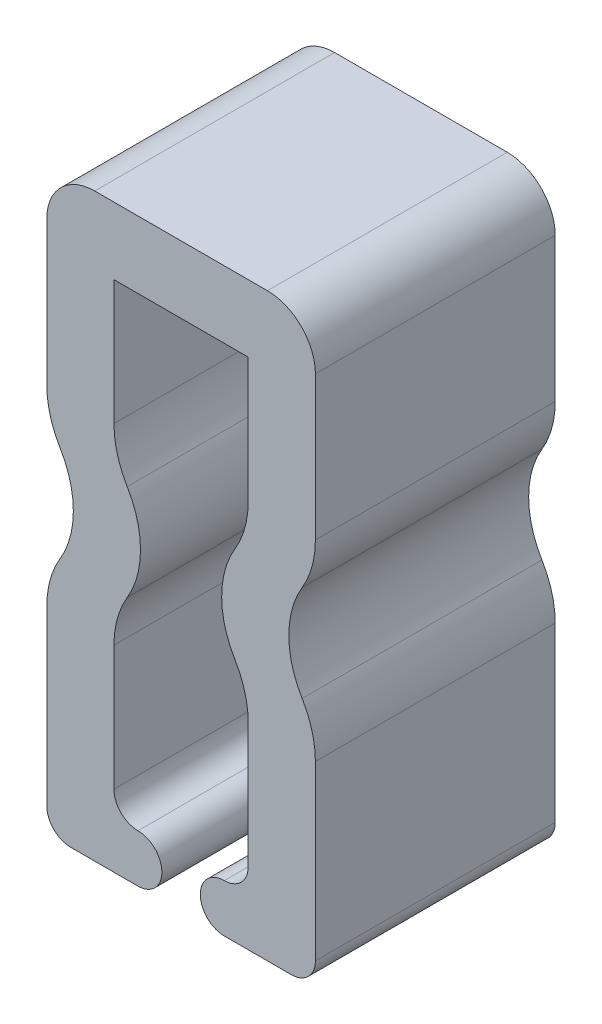
ISO-10303-21;
HEADER;
FILE_DESCRIPTION(('STEP AP214'),'2;1');
FILE_NAME('part.step','',(''),(''),'','','');
FILE_SCHEMA(('AUTOMOTIVE_DESIGN { 1 0 10303 214 1 1 1 1 }'));
ENDSEC;
DATA;
#1=APPLICATION_CONTEXT('core data for automotive mechanical design processes');
#2=APPLICATION_PROTOCOL_DEFINITION('international standard','automotive_design',2000,#1);
#3=PRODUCT_CONTEXT('',#1,'mechanical');
#4=PRODUCT('Part','Part','',(#3));
#5=PRODUCT_RELATED_PRODUCT_CATEGORY('part','',(#4));
#6=PRODUCT_DEFINITION_FORMATION('','',#4);
#7=PRODUCT_DEFINITION_CONTEXT('part definition',#1,'design');
#8=PRODUCT_DEFINITION('design','',#6,#7);
#9=PRODUCT_DEFINITION_SHAPE('','',#8);
#10=(LENGTH_UNIT() NAMED_UNIT(*) SI_UNIT(.MILLI.,.METRE.));
#11=(NAMED_UNIT(*) PLANE_ANGLE_UNIT() SI_UNIT($,.RADIAN.));
#12=(NAMED_UNIT(*) SI_UNIT($,.STERADIAN.) SOLID_ANGLE_UNIT());
#13=UNCERTAINTY_MEASURE_WITH_UNIT(LENGTH_MEASURE(1.E-05),#10,'distance_accuracy_value','');
#14=(GEOMETRIC_REPRESENTATION_CONTEXT(3) GLOBAL_UNCERTAINTY_ASSIGNED_CONTEXT((#13)) GLOBAL_UNIT_ASSIGNED_CONTEXT((#10,
#11,#12)) REPRESENTATION_CONTEXT('',''));
#15=CARTESIAN_POINT('',(0.,0.,0.));
#16=DIRECTION('',(0.,0.,1.));
#17=DIRECTION('',(1.,0.,0.));
#18=AXIS2_PLACEMENT_3D('',#15,#16,#17);
#19=CARTESIAN_POINT('',(-1.4,7.8,5.));
#20=DIRECTION('',(-1.,0.,0.));
#21=DIRECTION('',(0.,0.,1.));
#22=AXIS2_PLACEMENT_3D('',#19,#20,#21);
#23=PLANE('',#22);
#24=DIRECTION('',(0.,1.,0.));
#25=VECTOR('',#24,1.);
#26=CARTESIAN_POINT('',(-1.4,7.8,0.));
#27=LINE('',#26,#25);
#28=CARTESIAN_POINT('',(-1.4,5.2,0.));
#29=VERTEX_POINT('',#28);
#30=CARTESIAN_POINT('',(-1.4,7.8,0.));
#31=VERTEX_POINT('',#30);
#32=EDGE_CURVE('E284',#29,#31,#27,.T.);
#33=ORIENTED_EDGE('',*,*,#32,.T.);
#34=DIRECTION('',(0.,0.,-1.));
#35=VECTOR('',#34,1.);
#36=CARTESIAN_POINT('',(-1.4,7.8,5.));
#37=LINE('',#36,#35);
#38=CARTESIAN_POINT('',(-1.4,7.8,5.));
#39=VERTEX_POINT('',#38);
#40=EDGE_CURVE('E11',#39,#31,#37,.T.);
#41=ORIENTED_EDGE('',*,*,#40,.F.);
#42=DIRECTION('',(0.,1.,0.));
#43=VECTOR('',#42,1.);
#44=CARTESIAN_POINT('',(-1.4,7.8,5.));
#45=LINE('',#44,#43);
#46=CARTESIAN_POINT('',(-1.4,5.2,5.));
#47=VERTEX_POINT('',#46);
#48=EDGE_CURVE('E380',#47,#39,#45,.T.);
#49=ORIENTED_EDGE('',*,*,#48,.F.);
#50=DIRECTION('',(0.,0.,-1.));
#51=VECTOR('',#50,1.);
#52=CARTESIAN_POINT('',(-1.4,5.2,5.));
#53=LINE('',#52,#51);
#54=EDGE_CURVE('E280',#47,#29,#53,.T.);
#55=ORIENTED_EDGE('',*,*,#54,.T.);
#56=EDGE_LOOP('',(#33,#41,#49,#55));
#57=FACE_BOUND('',#56,.T.);
#58=ADVANCED_FACE('F39',(#57),#23,.F.);
#59=CARTESIAN_POINT('',(-1.4,7.8,5.));
#60=DIRECTION('',(0.,1.,0.));
#61=DIRECTION('',(0.,0.,1.));
#62=AXIS2_PLACEMENT_3D('',#59,#60,#61);
#63=PLANE('',#62);
#64=DIRECTION('',(1.,0.,0.));
#65=VECTOR('',#64,1.);
#66=CARTESIAN_POINT('',(-1.4,7.8,0.));
#67=LINE('',#66,#65);
#68=CARTESIAN_POINT('',(1.39999999999997,7.8,0.));
#69=VERTEX_POINT('',#68);
#70=EDGE_CURVE('E288',#31,#69,#67,.T.);
#71=ORIENTED_EDGE('',*,*,#70,.T.);
#72=DIRECTION('',(0.,0.,-1.));
#73=VECTOR('',#72,1.);
#74=CARTESIAN_POINT('',(1.39999999999997,7.8,5.));
#75=LINE('',#74,#73);
#76=CARTESIAN_POINT('',(1.39999999999997,7.8,5.));
#77=VERTEX_POINT('',#76);
#78=EDGE_CURVE('E48',#77,#69,#75,.T.);
#79=ORIENTED_EDGE('',*,*,#78,.F.);
#80=DIRECTION('',(1.,0.,0.));
#81=VECTOR('',#80,1.);
#82=CARTESIAN_POINT('',(-1.4,7.8,5.));
#83=LINE('',#82,#81);
#84=EDGE_CURVE('E171',#39,#77,#83,.T.);
#85=ORIENTED_EDGE('',*,*,#84,.F.);
#86=ORIENTED_EDGE('',*,*,#40,.T.);
#87=EDGE_LOOP('',(#71,#79,#85,#86));
#88=FACE_BOUND('',#87,.T.);
#89=ADVANCED_FACE('F614',(#88),#63,.F.);
#90=CARTESIAN_POINT('',(1.39999999999997,7.8,5.));
#91=DIRECTION('',(1.,0.,0.));
#92=DIRECTION('',(0.,1.,0.));
#93=AXIS2_PLACEMENT_3D('',#90,#91,#92);
#94=PLANE('',#93);
#95=DIRECTION('',(0.,-1.,0.));
#96=VECTOR('',#95,1.);
#97=CARTESIAN_POINT('',(1.39999999999997,7.8,0.));
#98=LINE('',#97,#96);
#99=CARTESIAN_POINT('',(1.39999999999999,5.2,0.));
#100=VERTEX_POINT('',#99);
#101=EDGE_CURVE('E291',#69,#100,#98,.T.);
#102=ORIENTED_EDGE('',*,*,#101,.T.);
#103=DIRECTION('',(0.,0.,-1.));
#104=VECTOR('',#103,1.);
#105=CARTESIAN_POINT('',(1.39999999999999,5.2,5.));
#106=LINE('',#105,#104);
#107=CARTESIAN_POINT('',(1.39999999999999,5.2,5.));
#108=VERTEX_POINT('',#107);
#109=EDGE_CURVE('E487',#108,#100,#106,.T.);
#110=ORIENTED_EDGE('',*,*,#109,.F.);
#111=DIRECTION('',(0.,-1.,0.));
#112=VECTOR('',#111,1.);
#113=CARTESIAN_POINT('',(1.39999999999997,7.8,5.));
#114=LINE('',#113,#112);
#115=EDGE_CURVE('E497',#77,#108,#114,.T.);
#116=ORIENTED_EDGE('',*,*,#115,.F.);
#117=ORIENTED_EDGE('',*,*,#78,.T.);
#118=EDGE_LOOP('',(#102,#110,#116,#117));
#119=FACE_BOUND('',#118,.T.);
#120=ADVANCED_FACE('F495',(#119),#94,.F.);
#121=CARTESIAN_POINT('',(-0.543650631615116,5.2,5.));
#122=DIRECTION('',(0.,0.,-1.));
#123=DIRECTION('',(-1.,0.,0.));
#124=AXIS2_PLACEMENT_3D('',#121,#122,#123);
#125=CYLINDRICAL_SURFACE('',#124,1.9436506316151);
#126=CARTESIAN_POINT('',(-0.543650631615116,5.2,0.));
#127=DIRECTION('',(0.,0.,-1.));
#128=DIRECTION('',(-1.,0.,0.));
#129=AXIS2_PLACEMENT_3D('',#126,#127,#128);
#130=CIRCLE('',#129,1.9436506316151);
#131=CARTESIAN_POINT('',(1.12301603505156,4.2,0.));
#132=VERTEX_POINT('',#131);
#133=EDGE_CURVE('E294',#100,#132,#130,.T.);
#134=ORIENTED_EDGE('',*,*,#133,.T.);
#135=DIRECTION('',(0.,0.,-1.));
#136=VECTOR('',#135,1.);
#137=CARTESIAN_POINT('',(1.12301603505156,4.2,5.));
#138=LINE('',#137,#136);
#139=CARTESIAN_POINT('',(1.12301603505156,4.2,5.));
#140=VERTEX_POINT('',#139);
#141=EDGE_CURVE('E483',#140,#132,#138,.T.);
#142=ORIENTED_EDGE('',*,*,#141,.F.);
#143=CARTESIAN_POINT('',(-0.543650631615116,5.2,5.));
#144=DIRECTION('',(0.,0.,-1.));
#145=DIRECTION('',(-1.,0.,0.));
#146=AXIS2_PLACEMENT_3D('',#143,#144,#145);
#147=CIRCLE('',#146,1.9436506316151);
#148=EDGE_CURVE('E516',#108,#140,#147,.T.);
#149=ORIENTED_EDGE('',*,*,#148,.F.);
#150=ORIENTED_EDGE('',*,*,#109,.T.);
#151=EDGE_LOOP('',(#134,#142,#149,#150));
#152=FACE_BOUND('',#151,.T.);
#153=ADVANCED_FACE('F506',(#152),#125,.F.);
#154=CARTESIAN_POINT('',(2.78968270171823,3.2,5.));
#155=DIRECTION('',(0.,0.,-1.));
#156=DIRECTION('',(-1.,0.,0.));
#157=AXIS2_PLACEMENT_3D('',#154,#155,#156);
#158=CYLINDRICAL_SURFACE('',#157,1.9436506316151);
#159=CARTESIAN_POINT('',(2.78968270171823,3.2,0.));
#160=DIRECTION('',(0.,0.,1.));
#161=DIRECTION('',(1.,0.,0.));
#162=AXIS2_PLACEMENT_3D('',#159,#160,#161);
#163=CIRCLE('',#162,1.9436506316151);
#164=CARTESIAN_POINT('',(1.12301603505157,2.2,0.));
#165=VERTEX_POINT('',#164);
#166=EDGE_CURVE('E297',#132,#165,#163,.T.);
#167=ORIENTED_EDGE('',*,*,#166,.T.);
#168=DIRECTION('',(0.,0.,-1.));
#169=VECTOR('',#168,1.);
#170=CARTESIAN_POINT('',(1.12301603505157,2.2,5.));
#171=LINE('',#170,#169);
#172=CARTESIAN_POINT('',(1.12301603505157,2.2,5.));
#173=VERTEX_POINT('',#172);
#174=EDGE_CURVE('E479',#173,#165,#171,.T.);
#175=ORIENTED_EDGE('',*,*,#174,.F.);
#176=CARTESIAN_POINT('',(2.78968270171823,3.2,5.));
#177=DIRECTION('',(0.,0.,1.));
#178=DIRECTION('',(1.,0.,0.));
#179=AXIS2_PLACEMENT_3D('',#176,#177,#178);
#180=CIRCLE('',#179,1.9436506316151);
#181=EDGE_CURVE('E512',#140,#173,#180,.T.);
#182=ORIENTED_EDGE('',*,*,#181,.F.);
#183=ORIENTED_EDGE('',*,*,#141,.T.);
#184=EDGE_LOOP('',(#167,#175,#182,#183));
#185=FACE_BOUND('',#184,.T.);
#186=ADVANCED_FACE('F510',(#185),#158,.T.);
#187=CARTESIAN_POINT('',(-0.543650631615089,1.2,5.));
#188=DIRECTION('',(0.,0.,-1.));
#189=DIRECTION('',(-1.,0.,0.));
#190=AXIS2_PLACEMENT_3D('',#187,#188,#189);
#191=CYLINDRICAL_SURFACE('',#190,1.9436506316151);
#192=CARTESIAN_POINT('',(-0.543650631615089,1.2,0.));
#193=DIRECTION('',(0.,0.,-1.));
#194=DIRECTION('',(1.,0.,0.));
#195=AXIS2_PLACEMENT_3D('',#192,#193,#194);
#196=CIRCLE('',#195,1.9436506316151);
#197=CARTESIAN_POINT('',(1.40000000000001,1.2,0.));
#198=VERTEX_POINT('',#197);
#199=EDGE_CURVE('E300',#165,#198,#196,.T.);
#200=ORIENTED_EDGE('',*,*,#199,.T.);
#201=DIRECTION('',(0.,0.,-1.));
#202=VECTOR('',#201,1.);
#203=CARTESIAN_POINT('',(1.40000000000001,1.2,5.));
#204=LINE('',#203,#202);
#205=CARTESIAN_POINT('',(1.40000000000001,1.2,5.));
#206=VERTEX_POINT('',#205);
#207=EDGE_CURVE('E475',#206,#198,#204,.T.);
#208=ORIENTED_EDGE('',*,*,#207,.F.);
#209=CARTESIAN_POINT('',(-0.543650631615089,1.2,5.));
#210=DIRECTION('',(0.,0.,-1.));
#211=DIRECTION('',(1.,0.,0.));
#212=AXIS2_PLACEMENT_3D('',#209,#210,#211);
#213=CIRCLE('',#212,1.9436506316151);
#214=EDGE_CURVE('E515',#173,#206,#213,.T.);
#215=ORIENTED_EDGE('',*,*,#214,.F.);
#216=ORIENTED_EDGE('',*,*,#174,.T.);
#217=EDGE_LOOP('',(#200,#208,#215,#216));
#218=FACE_BOUND('',#217,.T.);
#219=ADVANCED_FACE('F627',(#218),#191,.F.);
#220=CARTESIAN_POINT('',(1.40000000000003,-1.4,5.));
#221=DIRECTION('',(1.,0.,0.));
#222=DIRECTION('',(0.,1.,0.));
#223=AXIS2_PLACEMENT_3D('',#220,#221,#222);
#224=PLANE('',#223);
#225=DIRECTION('',(0.,-1.,0.));
#226=VECTOR('',#225,1.);
#227=CARTESIAN_POINT('',(1.40000000000003,-1.4,0.));
#228=LINE('',#227,#226);
#229=CARTESIAN_POINT('',(1.40000000000003,-1.4,0.));
#230=VERTEX_POINT('',#229);
#231=EDGE_CURVE('E303',#198,#230,#228,.T.);
#232=ORIENTED_EDGE('',*,*,#231,.T.);
#233=DIRECTION('',(0.,0.,-1.));
#234=VECTOR('',#233,1.);
#235=CARTESIAN_POINT('',(1.40000000000003,-1.4,5.));
#236=LINE('',#235,#234);
#237=CARTESIAN_POINT('',(1.40000000000003,-1.4,5.));
#238=VERTEX_POINT('',#237);
#239=EDGE_CURVE('E471',#238,#230,#236,.T.);
#240=ORIENTED_EDGE('',*,*,#239,.F.);
#241=DIRECTION('',(0.,-1.,0.));
#242=VECTOR('',#241,1.);
#243=CARTESIAN_POINT('',(1.40000000000003,-1.4,5.));
#244=LINE('',#243,#242);
#245=EDGE_CURVE('E520',#206,#238,#244,.T.);
#246=ORIENTED_EDGE('',*,*,#245,.F.);
#247=ORIENTED_EDGE('',*,*,#207,.T.);
#248=EDGE_LOOP('',(#232,#240,#246,#247));
#249=FACE_BOUND('',#248,.T.);
#250=ADVANCED_FACE('F630',(#249),#224,.F.);
#251=CARTESIAN_POINT('',(0.900000000000031,-1.4,5.));
#252=DIRECTION('',(0.,0.,-1.));
#253=DIRECTION('',(-1.,0.,0.));
#254=AXIS2_PLACEMENT_3D('',#251,#252,#253);
#255=CYLINDRICAL_SURFACE('',#254,0.5);
#256=CARTESIAN_POINT('',(0.900000000000031,-1.4,0.));
#257=DIRECTION('',(0.,0.,-1.));
#258=DIRECTION('',(-1.,0.,0.));
#259=AXIS2_PLACEMENT_3D('',#256,#257,#258);
#260=CIRCLE('',#259,0.5);
#261=CARTESIAN_POINT('',(0.900000000000035,-1.9,0.));
#262=VERTEX_POINT('',#261);
#263=EDGE_CURVE('E306',#230,#262,#260,.T.);
#264=ORIENTED_EDGE('',*,*,#263,.T.);
#265=DIRECTION('',(0.,0.,-1.));
#266=VECTOR('',#265,1.);
#267=CARTESIAN_POINT('',(0.900000000000035,-1.9,5.));
#268=LINE('',#267,#266);
#269=CARTESIAN_POINT('',(0.900000000000035,-1.9,5.));
#270=VERTEX_POINT('',#269);
#271=EDGE_CURVE('E467',#270,#262,#268,.T.);
#272=ORIENTED_EDGE('',*,*,#271,.F.);
#273=CARTESIAN_POINT('',(0.900000000000031,-1.4,5.));
#274=DIRECTION('',(0.,0.,-1.));
#275=DIRECTION('',(-1.,0.,0.));
#276=AXIS2_PLACEMENT_3D('',#273,#274,#275);
#277=CIRCLE('',#276,0.5);
#278=EDGE_CURVE('E527',#238,#270,#277,.T.);
#279=ORIENTED_EDGE('',*,*,#278,.F.);
#280=ORIENTED_EDGE('',*,*,#239,.T.);
#281=EDGE_LOOP('',(#264,#272,#279,#280));
#282=FACE_BOUND('',#281,.T.);
#283=ADVANCED_FACE('F634',(#282),#255,.F.);
#284=CARTESIAN_POINT('',(0.900000000000038,-2.4,5.));
#285=DIRECTION('',(0.,0.,-1.));
#286=DIRECTION('',(-1.,0.,0.));
#287=AXIS2_PLACEMENT_3D('',#284,#285,#286);
#288=CYLINDRICAL_SURFACE('',#287,0.5);
#289=CARTESIAN_POINT('',(0.900000000000038,-2.4,0.));
#290=DIRECTION('',(0.,0.,1.));
#291=DIRECTION('',(1.,0.,0.));
#292=AXIS2_PLACEMENT_3D('',#289,#290,#291);
#293=CIRCLE('',#292,0.5);
#294=CARTESIAN_POINT('',(0.900000000000041,-2.9,0.));
#295=VERTEX_POINT('',#294);
#296=EDGE_CURVE('E310',#262,#295,#293,.T.);
#297=ORIENTED_EDGE('',*,*,#296,.T.);
#298=DIRECTION('',(0.,0.,-1.));
#299=VECTOR('',#298,1.);
#300=CARTESIAN_POINT('',(0.900000000000041,-2.9,5.));
#301=LINE('',#300,#299);
#302=CARTESIAN_POINT('',(0.900000000000041,-2.9,5.));
#303=VERTEX_POINT('',#302);
#304=EDGE_CURVE('E463',#303,#295,#301,.T.);
#305=ORIENTED_EDGE('',*,*,#304,.F.);
#306=CARTESIAN_POINT('',(0.900000000000038,-2.4,5.));
#307=DIRECTION('',(0.,0.,1.));
#308=DIRECTION('',(1.,0.,0.));
#309=AXIS2_PLACEMENT_3D('',#306,#307,#308);
#310=CIRCLE('',#309,0.5);
#311=EDGE_CURVE('E530',#270,#303,#310,.T.);
#312=ORIENTED_EDGE('',*,*,#311,.F.);
#313=ORIENTED_EDGE('',*,*,#271,.T.);
#314=EDGE_LOOP('',(#297,#305,#312,#313));
#315=FACE_BOUND('',#314,.T.);
#316=ADVANCED_FACE('F638',(#315),#288,.T.);
#317=CARTESIAN_POINT('',(2.3,-2.9,5.));
#318=DIRECTION('',(0.,1.,0.));
#319=DIRECTION('',(0.,0.,1.));
#320=AXIS2_PLACEMENT_3D('',#317,#318,#319);
#321=PLANE('',#320);
#322=DIRECTION('',(1.,0.,0.));
#323=VECTOR('',#322,1.);
#324=CARTESIAN_POINT('',(2.3,-2.9,0.));
#325=LINE('',#324,#323);
#326=CARTESIAN_POINT('',(2.3,-2.9,0.));
#327=VERTEX_POINT('',#326);
#328=EDGE_CURVE('E313',#295,#327,#325,.T.);
#329=ORIENTED_EDGE('',*,*,#328,.T.);
#330=DIRECTION('',(0.,0.,-1.));
#331=VECTOR('',#330,1.);
#332=CARTESIAN_POINT('',(2.3,-2.9,5.));
#333=LINE('',#332,#331);
#334=CARTESIAN_POINT('',(2.3,-2.9,5.));
#335=VERTEX_POINT('',#334);
#336=EDGE_CURVE('E459',#335,#327,#333,.T.);
#337=ORIENTED_EDGE('',*,*,#336,.F.);
#338=DIRECTION('',(1.,0.,0.));
#339=VECTOR('',#338,1.);
#340=CARTESIAN_POINT('',(2.3,-2.9,5.));
#341=LINE('',#340,#339);
#342=EDGE_CURVE('E533',#303,#335,#341,.T.);
#343=ORIENTED_EDGE('',*,*,#342,.F.);
#344=ORIENTED_EDGE('',*,*,#304,.T.);
#345=EDGE_LOOP('',(#329,#337,#343,#344));
#346=FACE_BOUND('',#345,.T.);
#347=ADVANCED_FACE('F642',(#346),#321,.F.);
#348=CARTESIAN_POINT('',(2.3,-2.4,5.));
#349=DIRECTION('',(0.,0.,-1.));
#350=DIRECTION('',(-1.,0.,0.));
#351=AXIS2_PLACEMENT_3D('',#348,#349,#350);
#352=CYLINDRICAL_SURFACE('',#351,0.5);
#353=CARTESIAN_POINT('',(2.3,-2.4,0.));
#354=DIRECTION('',(0.,0.,1.));
#355=DIRECTION('',(-1.,0.,0.));
#356=AXIS2_PLACEMENT_3D('',#353,#354,#355);
#357=CIRCLE('',#356,0.5);
#358=CARTESIAN_POINT('',(2.8,-2.4,0.));
#359=VERTEX_POINT('',#358);
#360=EDGE_CURVE('E316',#327,#359,#357,.T.);
#361=ORIENTED_EDGE('',*,*,#360,.T.);
#362=DIRECTION('',(0.,0.,-1.));
#363=VECTOR('',#362,1.);
#364=CARTESIAN_POINT('',(2.8,-2.4,5.));
#365=LINE('',#364,#363);
#366=CARTESIAN_POINT('',(2.8,-2.4,5.));
#367=VERTEX_POINT('',#366);
#368=EDGE_CURVE('E455',#367,#359,#365,.T.);
#369=ORIENTED_EDGE('',*,*,#368,.F.);
#370=CARTESIAN_POINT('',(2.3,-2.4,5.));
#371=DIRECTION('',(0.,0.,1.));
#372=DIRECTION('',(-1.,0.,0.));
#373=AXIS2_PLACEMENT_3D('',#370,#371,#372);
#374=CIRCLE('',#373,0.5);
#375=EDGE_CURVE('E536',#335,#367,#374,.T.);
#376=ORIENTED_EDGE('',*,*,#375,.F.);
#377=ORIENTED_EDGE('',*,*,#336,.T.);
#378=EDGE_LOOP('',(#361,#369,#376,#377));
#379=FACE_BOUND('',#378,.T.);
#380=ADVANCED_FACE('F646',(#379),#352,.T.);
#381=CARTESIAN_POINT('',(2.8,1.2,5.));
#382=DIRECTION('',(-1.,0.,0.));
#383=DIRECTION('',(0.,-1.,0.));
#384=AXIS2_PLACEMENT_3D('',#381,#382,#383);
#385=PLANE('',#384);
#386=DIRECTION('',(0.,1.,0.));
#387=VECTOR('',#386,1.);
#388=CARTESIAN_POINT('',(2.8,1.2,0.));
#389=LINE('',#388,#387);
#390=CARTESIAN_POINT('',(2.8,1.2,0.));
#391=VERTEX_POINT('',#390);
#392=EDGE_CURVE('E319',#359,#391,#389,.T.);
#393=ORIENTED_EDGE('',*,*,#392,.T.);
#394=DIRECTION('',(0.,0.,-1.));
#395=VECTOR('',#394,1.);
#396=CARTESIAN_POINT('',(2.8,1.2,5.));
#397=LINE('',#396,#395);
#398=CARTESIAN_POINT('',(2.8,1.2,5.));
#399=VERTEX_POINT('',#398);
#400=EDGE_CURVE('E451',#399,#391,#397,.T.);
#401=ORIENTED_EDGE('',*,*,#400,.F.);
#402=DIRECTION('',(0.,1.,0.));
#403=VECTOR('',#402,1.);
#404=CARTESIAN_POINT('',(2.8,1.2,5.));
#405=LINE('',#404,#403);
#406=EDGE_CURVE('E539',#367,#399,#405,.T.);
#407=ORIENTED_EDGE('',*,*,#406,.F.);
#408=ORIENTED_EDGE('',*,*,#368,.T.);
#409=EDGE_LOOP('',(#393,#401,#407,#408));
#410=FACE_BOUND('',#409,.T.);
#411=ADVANCED_FACE('F650',(#410),#385,.F.);
#412=CARTESIAN_POINT('',(0.856349368384897,1.2,5.));
#413=DIRECTION('',(0.,0.,-1.));
#414=DIRECTION('',(-1.,0.,0.));
#415=AXIS2_PLACEMENT_3D('',#412,#413,#414);
#416=CYLINDRICAL_SURFACE('',#415,1.9436506316151);
#417=CARTESIAN_POINT('',(0.856349368384897,1.2,0.));
#418=DIRECTION('',(0.,0.,1.));
#419=DIRECTION('',(1.,0.,0.));
#420=AXIS2_PLACEMENT_3D('',#417,#418,#419);
#421=CIRCLE('',#420,1.9436506316151);
#422=CARTESIAN_POINT('',(2.52301603505157,2.2,0.));
#423=VERTEX_POINT('',#422);
#424=EDGE_CURVE('E322',#391,#423,#421,.T.);
#425=ORIENTED_EDGE('',*,*,#424,.T.);
#426=DIRECTION('',(0.,0.,-1.));
#427=VECTOR('',#426,1.);
#428=CARTESIAN_POINT('',(2.52301603505157,2.2,5.));
#429=LINE('',#428,#427);
#430=CARTESIAN_POINT('',(2.52301603505157,2.2,5.));
#431=VERTEX_POINT('',#430);
#432=EDGE_CURVE('E447',#431,#423,#429,.T.);
#433=ORIENTED_EDGE('',*,*,#432,.F.);
#434=CARTESIAN_POINT('',(0.856349368384897,1.2,5.));
#435=DIRECTION('',(0.,0.,1.));
#436=DIRECTION('',(1.,0.,0.));
#437=AXIS2_PLACEMENT_3D('',#434,#435,#436);
#438=CIRCLE('',#437,1.9436506316151);
#439=EDGE_CURVE('E542',#399,#431,#438,.T.);
#440=ORIENTED_EDGE('',*,*,#439,.F.);
#441=ORIENTED_EDGE('',*,*,#400,.T.);
#442=EDGE_LOOP('',(#425,#433,#440,#441));
#443=FACE_BOUND('',#442,.T.);
#444=ADVANCED_FACE('F654',(#443),#416,.T.);
#445=CARTESIAN_POINT('',(4.18968270171823,3.2,5.));
#446=DIRECTION('',(0.,0.,-1.));
#447=DIRECTION('',(-1.,0.,0.));
#448=AXIS2_PLACEMENT_3D('',#445,#446,#447);
#449=CYLINDRICAL_SURFACE('',#448,1.9436506316151);
#450=CARTESIAN_POINT('',(4.18968270171823,3.2,0.));
#451=DIRECTION('',(0.,0.,-1.));
#452=DIRECTION('',(1.,0.,0.));
#453=AXIS2_PLACEMENT_3D('',#450,#451,#452);
#454=CIRCLE('',#453,1.9436506316151);
#455=CARTESIAN_POINT('',(2.52301603505157,4.2,0.));
#456=VERTEX_POINT('',#455);
#457=EDGE_CURVE('E325',#423,#456,#454,.T.);
#458=ORIENTED_EDGE('',*,*,#457,.T.);
#459=DIRECTION('',(0.,0.,-1.));
#460=VECTOR('',#459,1.);
#461=CARTESIAN_POINT('',(2.52301603505157,4.2,5.));
#462=LINE('',#461,#460);
#463=CARTESIAN_POINT('',(2.52301603505157,4.2,5.));
#464=VERTEX_POINT('',#463);
#465=EDGE_CURVE('E443',#464,#456,#462,.T.);
#466=ORIENTED_EDGE('',*,*,#465,.F.);
#467=CARTESIAN_POINT('',(4.18968270171823,3.2,5.));
#468=DIRECTION('',(0.,0.,-1.));
#469=DIRECTION('',(1.,0.,0.));
#470=AXIS2_PLACEMENT_3D('',#467,#468,#469);
#471=CIRCLE('',#470,1.9436506316151);
#472=EDGE_CURVE('E545',#431,#464,#471,.T.);
#473=ORIENTED_EDGE('',*,*,#472,.F.);
#474=ORIENTED_EDGE('',*,*,#432,.T.);
#475=EDGE_LOOP('',(#458,#466,#473,#474));
#476=FACE_BOUND('',#475,.T.);
#477=ADVANCED_FACE('F658',(#476),#449,.F.);
#478=CARTESIAN_POINT('',(0.856349368384898,5.2,5.));
#479=DIRECTION('',(0.,0.,-1.));
#480=DIRECTION('',(-1.,0.,0.));
#481=AXIS2_PLACEMENT_3D('',#478,#479,#480);
#482=CYLINDRICAL_SURFACE('',#481,1.9436506316151);
#483=CARTESIAN_POINT('',(0.856349368384898,5.2,0.));
#484=DIRECTION('',(0.,0.,1.));
#485=DIRECTION('',(-1.,0.,0.));
#486=AXIS2_PLACEMENT_3D('',#483,#484,#485);
#487=CIRCLE('',#486,1.9436506316151);
#488=CARTESIAN_POINT('',(2.8,5.2,0.));
#489=VERTEX_POINT('',#488);
#490=EDGE_CURVE('E328',#456,#489,#487,.T.);
#491=ORIENTED_EDGE('',*,*,#490,.T.);
#492=DIRECTION('',(0.,0.,-1.));
#493=VECTOR('',#492,1.);
#494=CARTESIAN_POINT('',(2.8,5.2,5.));
#495=LINE('',#494,#493);
#496=CARTESIAN_POINT('',(2.8,5.2,5.));
#497=VERTEX_POINT('',#496);
#498=EDGE_CURVE('E439',#497,#489,#495,.T.);
#499=ORIENTED_EDGE('',*,*,#498,.F.);
#500=CARTESIAN_POINT('',(0.856349368384898,5.2,5.));
#501=DIRECTION('',(0.,0.,1.));
#502=DIRECTION('',(-1.,0.,0.));
#503=AXIS2_PLACEMENT_3D('',#500,#501,#502);
#504=CIRCLE('',#503,1.9436506316151);
#505=EDGE_CURVE('E548',#464,#497,#504,.T.);
#506=ORIENTED_EDGE('',*,*,#505,.F.);
#507=ORIENTED_EDGE('',*,*,#465,.T.);
#508=EDGE_LOOP('',(#491,#499,#506,#507));
#509=FACE_BOUND('',#508,.T.);
#510=ADVANCED_FACE('F662',(#509),#482,.T.);
#511=CARTESIAN_POINT('',(2.8,8.19999999999987,5.));
#512=DIRECTION('',(-1.,0.,0.));
#513=DIRECTION('',(0.,-1.,0.));
#514=AXIS2_PLACEMENT_3D('',#511,#512,#513);
#515=PLANE('',#514);
#516=DIRECTION('',(0.,1.,0.));
#517=VECTOR('',#516,1.);
#518=CARTESIAN_POINT('',(2.8,8.19999999999987,0.));
#519=LINE('',#518,#517);
#520=CARTESIAN_POINT('',(2.8,8.19999999999987,0.));
#521=VERTEX_POINT('',#520);
#522=EDGE_CURVE('E331',#489,#521,#519,.T.);
#523=ORIENTED_EDGE('',*,*,#522,.T.);
#524=DIRECTION('',(0.,0.,-1.));
#525=VECTOR('',#524,1.);
#526=CARTESIAN_POINT('',(2.8,8.19999999999987,5.));
#527=LINE('',#526,#525);
#528=CARTESIAN_POINT('',(2.8,8.19999999999987,5.));
#529=VERTEX_POINT('',#528);
#530=EDGE_CURVE('E435',#529,#521,#527,.T.);
#531=ORIENTED_EDGE('',*,*,#530,.F.);
#532=DIRECTION('',(0.,1.,0.));
#533=VECTOR('',#532,1.);
#534=CARTESIAN_POINT('',(2.8,8.19999999999987,5.));
#535=LINE('',#534,#533);
#536=EDGE_CURVE('E551',#497,#529,#535,.T.);
#537=ORIENTED_EDGE('',*,*,#536,.F.);
#538=ORIENTED_EDGE('',*,*,#498,.T.);
#539=EDGE_LOOP('',(#523,#531,#537,#538));
#540=FACE_BOUND('',#539,.T.);
#541=ADVANCED_FACE('F666',(#540),#515,.F.);
#542=CARTESIAN_POINT('',(1.8,8.19999999999987,5.));
#543=DIRECTION('',(0.,0.,-1.));
#544=DIRECTION('',(-1.,0.,0.));
#545=AXIS2_PLACEMENT_3D('',#542,#543,#544);
#546=CYLINDRICAL_SURFACE('',#545,1.);
#547=CARTESIAN_POINT('',(1.8,8.19999999999987,0.));
#548=DIRECTION('',(0.,0.,1.));
#549=DIRECTION('',(1.,0.,0.));
#550=AXIS2_PLACEMENT_3D('',#547,#548,#549);
#551=CIRCLE('',#550,1.);
#552=CARTESIAN_POINT('',(1.8,9.19999999999987,0.));
#553=VERTEX_POINT('',#552);
#554=EDGE_CURVE('E334',#521,#553,#551,.T.);
#555=ORIENTED_EDGE('',*,*,#554,.T.);
#556=DIRECTION('',(0.,0.,-1.));
#557=VECTOR('',#556,1.);
#558=CARTESIAN_POINT('',(1.8,9.19999999999987,5.));
#559=LINE('',#558,#557);
#560=CARTESIAN_POINT('',(1.8,9.19999999999987,5.));
#561=VERTEX_POINT('',#560);
#562=EDGE_CURVE('E431',#561,#553,#559,.T.);
#563=ORIENTED_EDGE('',*,*,#562,.F.);
#564=CARTESIAN_POINT('',(1.8,8.19999999999987,5.));
#565=DIRECTION('',(0.,0.,1.));
#566=DIRECTION('',(1.,0.,0.));
#567=AXIS2_PLACEMENT_3D('',#564,#565,#566);
#568=CIRCLE('',#567,1.);
#569=EDGE_CURVE('E554',#529,#561,#568,.T.);
#570=ORIENTED_EDGE('',*,*,#569,.F.);
#571=ORIENTED_EDGE('',*,*,#530,.T.);
#572=EDGE_LOOP('',(#555,#563,#570,#571));
#573=FACE_BOUND('',#572,.T.);
#574=ADVANCED_FACE('F670',(#573),#546,.T.);
#575=CARTESIAN_POINT('',(1.8,9.19999999999987,5.));
#576=DIRECTION('',(0.,-1.,0.));
#577=DIRECTION('',(0.,0.,-1.));
#578=AXIS2_PLACEMENT_3D('',#575,#576,#577);
#579=PLANE('',#578);
#580=DIRECTION('',(-1.,0.,0.));
#581=VECTOR('',#580,1.);
#582=CARTESIAN_POINT('',(1.8,9.19999999999987,0.));
#583=LINE('',#582,#581);
#584=CARTESIAN_POINT('',(-1.8,9.19999999999987,0.));
#585=VERTEX_POINT('',#584);
#586=EDGE_CURVE('E337',#553,#585,#583,.T.);
#587=ORIENTED_EDGE('',*,*,#586,.T.);
#588=DIRECTION('',(0.,0.,-1.));
#589=VECTOR('',#588,1.);
#590=CARTESIAN_POINT('',(-1.8,9.19999999999987,5.));
#591=LINE('',#590,#589);
#592=CARTESIAN_POINT('',(-1.8,9.19999999999987,5.));
#593=VERTEX_POINT('',#592);
#594=EDGE_CURVE('E427',#593,#585,#591,.T.);
#595=ORIENTED_EDGE('',*,*,#594,.F.);
#596=DIRECTION('',(-1.,0.,0.));
#597=VECTOR('',#596,1.);
#598=CARTESIAN_POINT('',(1.8,9.19999999999987,5.));
#599=LINE('',#598,#597);
#600=EDGE_CURVE('E557',#561,#593,#599,.T.);
#601=ORIENTED_EDGE('',*,*,#600,.F.);
#602=ORIENTED_EDGE('',*,*,#562,.T.);
#603=EDGE_LOOP('',(#587,#595,#601,#602));
#604=FACE_BOUND('',#603,.T.);
#605=ADVANCED_FACE('F674',(#604),#579,.F.);
#606=CARTESIAN_POINT('',(-1.8,8.19999999999987,5.));
#607=DIRECTION('',(0.,0.,-1.));
#608=DIRECTION('',(-1.,0.,0.));
#609=AXIS2_PLACEMENT_3D('',#606,#607,#608);
#610=CYLINDRICAL_SURFACE('',#609,1.);
#611=CARTESIAN_POINT('',(-1.8,8.19999999999987,0.));
#612=DIRECTION('',(0.,0.,1.));
#613=DIRECTION('',(-1.,0.,0.));
#614=AXIS2_PLACEMENT_3D('',#611,#612,#613);
#615=CIRCLE('',#614,1.);
#616=CARTESIAN_POINT('',(-2.8,8.19999999999987,0.));
#617=VERTEX_POINT('',#616);
#618=EDGE_CURVE('E340',#585,#617,#615,.T.);
#619=ORIENTED_EDGE('',*,*,#618,.T.);
#620=DIRECTION('',(0.,0.,-1.));
#621=VECTOR('',#620,1.);
#622=CARTESIAN_POINT('',(-2.8,8.19999999999987,5.));
#623=LINE('',#622,#621);
#624=CARTESIAN_POINT('',(-2.8,8.19999999999987,5.));
#625=VERTEX_POINT('',#624);
#626=EDGE_CURVE('E423',#625,#617,#623,.T.);
#627=ORIENTED_EDGE('',*,*,#626,.F.);
#628=CARTESIAN_POINT('',(-1.8,8.19999999999987,5.));
#629=DIRECTION('',(0.,0.,1.));
#630=DIRECTION('',(-1.,0.,0.));
#631=AXIS2_PLACEMENT_3D('',#628,#629,#630);
#632=CIRCLE('',#631,1.);
#633=EDGE_CURVE('E560',#593,#625,#632,.T.);
#634=ORIENTED_EDGE('',*,*,#633,.F.);
#635=ORIENTED_EDGE('',*,*,#594,.T.);
#636=EDGE_LOOP('',(#619,#627,#634,#635));
#637=FACE_BOUND('',#636,.T.);
#638=ADVANCED_FACE('F678',(#637),#610,.T.);
#639=CARTESIAN_POINT('',(-2.8,8.19999999999987,5.));
#640=DIRECTION('',(1.,0.,0.));
#641=DIRECTION('',(0.,1.,0.));
#642=AXIS2_PLACEMENT_3D('',#639,#640,#641);
#643=PLANE('',#642);
#644=DIRECTION('',(0.,-1.,0.));
#645=VECTOR('',#644,1.);
#646=CARTESIAN_POINT('',(-2.8,8.19999999999987,0.));
#647=LINE('',#646,#645);
#648=CARTESIAN_POINT('',(-2.8,5.2,0.));
#649=VERTEX_POINT('',#648);
#650=EDGE_CURVE('E343',#617,#649,#647,.T.);
#651=ORIENTED_EDGE('',*,*,#650,.T.);
#652=DIRECTION('',(0.,0.,-1.));
#653=VECTOR('',#652,1.);
#654=CARTESIAN_POINT('',(-2.8,5.2,5.));
#655=LINE('',#654,#653);
#656=CARTESIAN_POINT('',(-2.8,5.2,5.));
#657=VERTEX_POINT('',#656);
#658=EDGE_CURVE('E419',#657,#649,#655,.T.);
#659=ORIENTED_EDGE('',*,*,#658,.F.);
#660=DIRECTION('',(0.,-1.,0.));
#661=VECTOR('',#660,1.);
#662=CARTESIAN_POINT('',(-2.8,8.19999999999987,5.));
#663=LINE('',#662,#661);
#664=EDGE_CURVE('E563',#625,#657,#663,.T.);
#665=ORIENTED_EDGE('',*,*,#664,.F.);
#666=ORIENTED_EDGE('',*,*,#626,.T.);
#667=EDGE_LOOP('',(#651,#659,#665,#666));
#668=FACE_BOUND('',#667,.T.);
#669=ADVANCED_FACE('F682',(#668),#643,.F.);
#670=CARTESIAN_POINT('',(-0.856349368384898,5.2,5.));
#671=DIRECTION('',(0.,0.,-1.));
#672=DIRECTION('',(-1.,0.,0.));
#673=AXIS2_PLACEMENT_3D('',#670,#671,#672);
#674=CYLINDRICAL_SURFACE('',#673,1.9436506316151);
#675=CARTESIAN_POINT('',(-0.856349368384898,5.2,0.));
#676=DIRECTION('',(0.,0.,1.));
#677=DIRECTION('',(1.,0.,0.));
#678=AXIS2_PLACEMENT_3D('',#675,#676,#677);
#679=CIRCLE('',#678,1.9436506316151);
#680=CARTESIAN_POINT('',(-2.52301603505157,4.2,0.));
#681=VERTEX_POINT('',#680);
#682=EDGE_CURVE('E346',#649,#681,#679,.T.);
#683=ORIENTED_EDGE('',*,*,#682,.T.);
#684=DIRECTION('',(0.,0.,-1.));
#685=VECTOR('',#684,1.);
#686=CARTESIAN_POINT('',(-2.52301603505157,4.2,5.));
#687=LINE('',#686,#685);
#688=CARTESIAN_POINT('',(-2.52301603505157,4.2,5.));
#689=VERTEX_POINT('',#688);
#690=EDGE_CURVE('E415',#689,#681,#687,.T.);
#691=ORIENTED_EDGE('',*,*,#690,.F.);
#692=CARTESIAN_POINT('',(-0.856349368384898,5.2,5.));
#693=DIRECTION('',(0.,0.,1.));
#694=DIRECTION('',(1.,0.,0.));
#695=AXIS2_PLACEMENT_3D('',#692,#693,#694);
#696=CIRCLE('',#695,1.9436506316151);
#697=EDGE_CURVE('E566',#657,#689,#696,.T.);
#698=ORIENTED_EDGE('',*,*,#697,.F.);
#699=ORIENTED_EDGE('',*,*,#658,.T.);
#700=EDGE_LOOP('',(#683,#691,#698,#699));
#701=FACE_BOUND('',#700,.T.);
#702=ADVANCED_FACE('F686',(#701),#674,.T.);
#703=CARTESIAN_POINT('',(-4.18968270171823,3.2,5.));
#704=DIRECTION('',(0.,0.,-1.));
#705=DIRECTION('',(-1.,0.,0.));
#706=AXIS2_PLACEMENT_3D('',#703,#704,#705);
#707=CYLINDRICAL_SURFACE('',#706,1.9436506316151);
#708=CARTESIAN_POINT('',(-4.18968270171823,3.2,0.));
#709=DIRECTION('',(0.,0.,-1.));
#710=DIRECTION('',(-1.,0.,0.));
#711=AXIS2_PLACEMENT_3D('',#708,#709,#710);
#712=CIRCLE('',#711,1.9436506316151);
#713=CARTESIAN_POINT('',(-2.52301603505156,2.2,0.));
#714=VERTEX_POINT('',#713);
#715=EDGE_CURVE('E349',#681,#714,#712,.T.);
#716=ORIENTED_EDGE('',*,*,#715,.T.);
#717=DIRECTION('',(0.,0.,-1.));
#718=VECTOR('',#717,1.);
#719=CARTESIAN_POINT('',(-2.52301603505156,2.2,5.));
#720=LINE('',#719,#718);
#721=CARTESIAN_POINT('',(-2.52301603505156,2.2,5.));
#722=VERTEX_POINT('',#721);
#723=EDGE_CURVE('E411',#722,#714,#720,.T.);
#724=ORIENTED_EDGE('',*,*,#723,.F.);
#725=CARTESIAN_POINT('',(-4.18968270171823,3.2,5.));
#726=DIRECTION('',(0.,0.,-1.));
#727=DIRECTION('',(-1.,0.,0.));
#728=AXIS2_PLACEMENT_3D('',#725,#726,#727);
#729=CIRCLE('',#728,1.9436506316151);
#730=EDGE_CURVE('E569',#689,#722,#729,.T.);
#731=ORIENTED_EDGE('',*,*,#730,.F.);
#732=ORIENTED_EDGE('',*,*,#690,.T.);
#733=EDGE_LOOP('',(#716,#724,#731,#732));
#734=FACE_BOUND('',#733,.T.);
#735=ADVANCED_FACE('F690',(#734),#707,.F.);
#736=CARTESIAN_POINT('',(-0.856349368384897,1.2,5.));
#737=DIRECTION('',(0.,0.,-1.));
#738=DIRECTION('',(-1.,0.,0.));
#739=AXIS2_PLACEMENT_3D('',#736,#737,#738);
#740=CYLINDRICAL_SURFACE('',#739,1.9436506316151);
#741=CARTESIAN_POINT('',(-0.856349368384897,1.2,0.));
#742=DIRECTION('',(0.,0.,1.));
#743=DIRECTION('',(-1.,0.,0.));
#744=AXIS2_PLACEMENT_3D('',#741,#742,#743);
#745=CIRCLE('',#744,1.9436506316151);
#746=CARTESIAN_POINT('',(-2.8,1.2,0.));
#747=VERTEX_POINT('',#746);
#748=EDGE_CURVE('E352',#714,#747,#745,.T.);
#749=ORIENTED_EDGE('',*,*,#748,.T.);
#750=DIRECTION('',(0.,0.,-1.));
#751=VECTOR('',#750,1.);
#752=CARTESIAN_POINT('',(-2.8,1.2,5.));
#753=LINE('',#752,#751);
#754=CARTESIAN_POINT('',(-2.8,1.2,5.));
#755=VERTEX_POINT('',#754);
#756=EDGE_CURVE('E407',#755,#747,#753,.T.);
#757=ORIENTED_EDGE('',*,*,#756,.F.);
#758=CARTESIAN_POINT('',(-0.856349368384897,1.2,5.));
#759=DIRECTION('',(0.,0.,1.));
#760=DIRECTION('',(-1.,0.,0.));
#761=AXIS2_PLACEMENT_3D('',#758,#759,#760);
#762=CIRCLE('',#761,1.9436506316151);
#763=EDGE_CURVE('E572',#722,#755,#762,.T.);
#764=ORIENTED_EDGE('',*,*,#763,.F.);
#765=ORIENTED_EDGE('',*,*,#723,.T.);
#766=EDGE_LOOP('',(#749,#757,#764,#765));
#767=FACE_BOUND('',#766,.T.);
#768=ADVANCED_FACE('F694',(#767),#740,.T.);
#769=CARTESIAN_POINT('',(-2.8,1.2,5.));
#770=DIRECTION('',(1.,0.,0.));
#771=DIRECTION('',(0.,1.,0.));
#772=AXIS2_PLACEMENT_3D('',#769,#770,#771);
#773=PLANE('',#772);
#774=DIRECTION('',(0.,-1.,0.));
#775=VECTOR('',#774,1.);
#776=CARTESIAN_POINT('',(-2.8,1.2,0.));
#777=LINE('',#776,#775);
#778=CARTESIAN_POINT('',(-2.8,-2.4,0.));
#779=VERTEX_POINT('',#778);
#780=EDGE_CURVE('E355',#747,#779,#777,.T.);
#781=ORIENTED_EDGE('',*,*,#780,.T.);
#782=DIRECTION('',(0.,0.,-1.));
#783=VECTOR('',#782,1.);
#784=CARTESIAN_POINT('',(-2.8,-2.4,5.));
#785=LINE('',#784,#783);
#786=CARTESIAN_POINT('',(-2.8,-2.4,5.));
#787=VERTEX_POINT('',#786);
#788=EDGE_CURVE('E403',#787,#779,#785,.T.);
#789=ORIENTED_EDGE('',*,*,#788,.F.);
#790=DIRECTION('',(0.,-1.,0.));
#791=VECTOR('',#790,1.);
#792=CARTESIAN_POINT('',(-2.8,1.2,5.));
#793=LINE('',#792,#791);
#794=EDGE_CURVE('E575',#755,#787,#793,.T.);
#795=ORIENTED_EDGE('',*,*,#794,.F.);
#796=ORIENTED_EDGE('',*,*,#756,.T.);
#797=EDGE_LOOP('',(#781,#789,#795,#796));
#798=FACE_BOUND('',#797,.T.);
#799=ADVANCED_FACE('F698',(#798),#773,.F.);
#800=CARTESIAN_POINT('',(-2.3,-2.4,5.));
#801=DIRECTION('',(0.,0.,-1.));
#802=DIRECTION('',(-1.,0.,0.));
#803=AXIS2_PLACEMENT_3D('',#800,#801,#802);
#804=CYLINDRICAL_SURFACE('',#803,0.5);
#805=CARTESIAN_POINT('',(-2.3,-2.4,0.));
#806=DIRECTION('',(0.,0.,1.));
#807=DIRECTION('',(1.,0.,0.));
#808=AXIS2_PLACEMENT_3D('',#805,#806,#807);
#809=CIRCLE('',#808,0.5);
#810=CARTESIAN_POINT('',(-2.3,-2.9,0.));
#811=VERTEX_POINT('',#810);
#812=EDGE_CURVE('E358',#779,#811,#809,.T.);
#813=ORIENTED_EDGE('',*,*,#812,.T.);
#814=DIRECTION('',(0.,0.,-1.));
#815=VECTOR('',#814,1.);
#816=CARTESIAN_POINT('',(-2.3,-2.9,5.));
#817=LINE('',#816,#815);
#818=CARTESIAN_POINT('',(-2.3,-2.9,5.));
#819=VERTEX_POINT('',#818);
#820=EDGE_CURVE('E399',#819,#811,#817,.T.);
#821=ORIENTED_EDGE('',*,*,#820,.F.);
#822=CARTESIAN_POINT('',(-2.3,-2.4,5.));
#823=DIRECTION('',(0.,0.,1.));
#824=DIRECTION('',(1.,0.,0.));
#825=AXIS2_PLACEMENT_3D('',#822,#823,#824);
#826=CIRCLE('',#825,0.5);
#827=EDGE_CURVE('E578',#787,#819,#826,.T.);
#828=ORIENTED_EDGE('',*,*,#827,.F.);
#829=ORIENTED_EDGE('',*,*,#788,.T.);
#830=EDGE_LOOP('',(#813,#821,#828,#829));
#831=FACE_BOUND('',#830,.T.);
#832=ADVANCED_FACE('F702',(#831),#804,.T.);
#833=CARTESIAN_POINT('',(-2.3,-2.9,5.));
#834=DIRECTION('',(0.,1.,0.));
#835=DIRECTION('',(0.,0.,1.));
#836=AXIS2_PLACEMENT_3D('',#833,#834,#835);
#837=PLANE('',#836);
#838=DIRECTION('',(1.,0.,0.));
#839=VECTOR('',#838,1.);
#840=CARTESIAN_POINT('',(-2.3,-2.9,0.));
#841=LINE('',#840,#839);
#842=CARTESIAN_POINT('',(-0.9,-2.9,0.));
#843=VERTEX_POINT('',#842);
#844=EDGE_CURVE('E361',#811,#843,#841,.T.);
#845=ORIENTED_EDGE('',*,*,#844,.T.);
#846=DIRECTION('',(0.,0.,-1.));
#847=VECTOR('',#846,1.);
#848=CARTESIAN_POINT('',(-0.9,-2.9,5.));
#849=LINE('',#848,#847);
#850=CARTESIAN_POINT('',(-0.9,-2.9,5.));
#851=VERTEX_POINT('',#850);
#852=EDGE_CURVE('E395',#851,#843,#849,.T.);
#853=ORIENTED_EDGE('',*,*,#852,.F.);
#854=DIRECTION('',(1.,0.,0.));
#855=VECTOR('',#854,1.);
#856=CARTESIAN_POINT('',(-2.3,-2.9,5.));
#857=LINE('',#856,#855);
#858=EDGE_CURVE('E581',#819,#851,#857,.T.);
#859=ORIENTED_EDGE('',*,*,#858,.F.);
#860=ORIENTED_EDGE('',*,*,#820,.T.);
#861=EDGE_LOOP('',(#845,#853,#859,#860));
#862=FACE_BOUND('',#861,.T.);
#863=ADVANCED_FACE('F706',(#862),#837,.F.);
#864=CARTESIAN_POINT('',(-0.9,-2.4,5.));
#865=DIRECTION('',(0.,0.,-1.));
#866=DIRECTION('',(-1.,0.,0.));
#867=AXIS2_PLACEMENT_3D('',#864,#865,#866);
#868=CYLINDRICAL_SURFACE('',#867,0.5);
#869=CARTESIAN_POINT('',(-0.9,-2.4,0.));
#870=DIRECTION('',(0.,0.,1.));
#871=DIRECTION('',(-1.,0.,0.));
#872=AXIS2_PLACEMENT_3D('',#869,#870,#871);
#873=CIRCLE('',#872,0.5);
#874=CARTESIAN_POINT('',(-0.9,-1.9,0.));
#875=VERTEX_POINT('',#874);
#876=EDGE_CURVE('E365',#843,#875,#873,.T.);
#877=ORIENTED_EDGE('',*,*,#876,.T.);
#878=DIRECTION('',(0.,0.,-1.));
#879=VECTOR('',#878,1.);
#880=CARTESIAN_POINT('',(-0.9,-1.9,5.));
#881=LINE('',#880,#879);
#882=CARTESIAN_POINT('',(-0.9,-1.9,5.));
#883=VERTEX_POINT('',#882);
#884=EDGE_CURVE('E391',#883,#875,#881,.T.);
#885=ORIENTED_EDGE('',*,*,#884,.F.);
#886=CARTESIAN_POINT('',(-0.9,-2.4,5.));
#887=DIRECTION('',(0.,0.,1.));
#888=DIRECTION('',(-1.,0.,0.));
#889=AXIS2_PLACEMENT_3D('',#886,#887,#888);
#890=CIRCLE('',#889,0.5);
#891=EDGE_CURVE('E584',#851,#883,#890,.T.);
#892=ORIENTED_EDGE('',*,*,#891,.F.);
#893=ORIENTED_EDGE('',*,*,#852,.T.);
#894=EDGE_LOOP('',(#877,#885,#892,#893));
#895=FACE_BOUND('',#894,.T.);
#896=ADVANCED_FACE('F710',(#895),#868,.T.);
#897=CARTESIAN_POINT('',(-0.9,-1.4,5.));
#898=DIRECTION('',(0.,0.,-1.));
#899=DIRECTION('',(-1.,0.,0.));
#900=AXIS2_PLACEMENT_3D('',#897,#898,#899);
#901=CYLINDRICAL_SURFACE('',#900,0.5);
#902=CARTESIAN_POINT('',(-0.9,-1.4,0.));
#903=DIRECTION('',(0.,0.,-1.));
#904=DIRECTION('',(1.,0.,0.));
#905=AXIS2_PLACEMENT_3D('',#902,#903,#904);
#906=CIRCLE('',#905,0.5);
#907=CARTESIAN_POINT('',(-1.4,-1.4,0.));
#908=VERTEX_POINT('',#907);
#909=EDGE_CURVE('E368',#875,#908,#906,.T.);
#910=ORIENTED_EDGE('',*,*,#909,.T.);
#911=DIRECTION('',(0.,0.,-1.));
#912=VECTOR('',#911,1.);
#913=CARTESIAN_POINT('',(-1.4,-1.4,5.));
#914=LINE('',#913,#912);
#915=CARTESIAN_POINT('',(-1.4,-1.4,5.));
#916=VERTEX_POINT('',#915);
#917=EDGE_CURVE('E387',#916,#908,#914,.T.);
#918=ORIENTED_EDGE('',*,*,#917,.F.);
#919=CARTESIAN_POINT('',(-0.9,-1.4,5.));
#920=DIRECTION('',(0.,0.,-1.));
#921=DIRECTION('',(1.,0.,0.));
#922=AXIS2_PLACEMENT_3D('',#919,#920,#921);
#923=CIRCLE('',#922,0.5);
#924=EDGE_CURVE('E587',#883,#916,#923,.T.);
#925=ORIENTED_EDGE('',*,*,#924,.F.);
#926=ORIENTED_EDGE('',*,*,#884,.T.);
#927=EDGE_LOOP('',(#910,#918,#925,#926));
#928=FACE_BOUND('',#927,.T.);
#929=ADVANCED_FACE('F595',(#928),#901,.F.);
#930=CARTESIAN_POINT('',(-1.4,-1.4,5.));
#931=DIRECTION('',(-1.,0.,0.));
#932=DIRECTION('',(0.,0.,1.));
#933=AXIS2_PLACEMENT_3D('',#930,#931,#932);
#934=PLANE('',#933);
#935=DIRECTION('',(0.,1.,0.));
#936=VECTOR('',#935,1.);
#937=CARTESIAN_POINT('',(-1.4,-1.4,0.));
#938=LINE('',#937,#936);
#939=CARTESIAN_POINT('',(-1.4,1.2,0.));
#940=VERTEX_POINT('',#939);
#941=EDGE_CURVE('E371',#908,#940,#938,.T.);
#942=ORIENTED_EDGE('',*,*,#941,.T.);
#943=DIRECTION('',(0.,0.,-1.));
#944=VECTOR('',#943,1.);
#945=CARTESIAN_POINT('',(-1.4,1.2,5.));
#946=LINE('',#945,#944);
#947=CARTESIAN_POINT('',(-1.4,1.2,5.));
#948=VERTEX_POINT('',#947);
#949=EDGE_CURVE('E273',#948,#940,#946,.T.);
#950=ORIENTED_EDGE('',*,*,#949,.F.);
#951=DIRECTION('',(0.,1.,0.));
#952=VECTOR('',#951,1.);
#953=CARTESIAN_POINT('',(-1.4,-1.4,5.));
#954=LINE('',#953,#952);
#955=EDGE_CURVE('E262',#916,#948,#954,.T.);
#956=ORIENTED_EDGE('',*,*,#955,.F.);
#957=ORIENTED_EDGE('',*,*,#917,.T.);
#958=EDGE_LOOP('',(#942,#950,#956,#957));
#959=FACE_BOUND('',#958,.T.);
#960=ADVANCED_FACE('F599',(#959),#934,.F.);
#961=CARTESIAN_POINT('',(0.543650631615102,1.2,5.));
#962=DIRECTION('',(0.,0.,-1.));
#963=DIRECTION('',(-1.,0.,0.));
#964=AXIS2_PLACEMENT_3D('',#961,#962,#963);
#965=CYLINDRICAL_SURFACE('',#964,1.9436506316151);
#966=CARTESIAN_POINT('',(0.543650631615102,1.2,0.));
#967=DIRECTION('',(0.,0.,-1.));
#968=DIRECTION('',(-1.,0.,0.));
#969=AXIS2_PLACEMENT_3D('',#966,#967,#968);
#970=CIRCLE('',#969,1.9436506316151);
#971=CARTESIAN_POINT('',(-1.12301603505157,2.2,0.));
#972=VERTEX_POINT('',#971);
#973=EDGE_CURVE('E271',#940,#972,#970,.T.);
#974=ORIENTED_EDGE('',*,*,#973,.T.);
#975=DIRECTION('',(0.,0.,-1.));
#976=VECTOR('',#975,1.);
#977=CARTESIAN_POINT('',(-1.12301603505157,2.2,5.));
#978=LINE('',#977,#976);
#979=CARTESIAN_POINT('',(-1.12301603505157,2.2,5.));
#980=VERTEX_POINT('',#979);
#981=EDGE_CURVE('E268',#980,#972,#978,.T.);
#982=ORIENTED_EDGE('',*,*,#981,.F.);
#983=CARTESIAN_POINT('',(0.543650631615102,1.2,5.));
#984=DIRECTION('',(0.,0.,-1.));
#985=DIRECTION('',(-1.,0.,0.));
#986=AXIS2_PLACEMENT_3D('',#983,#984,#985);
#987=CIRCLE('',#986,1.9436506316151);
#988=EDGE_CURVE('E256',#948,#980,#987,.T.);
#989=ORIENTED_EDGE('',*,*,#988,.F.);
#990=ORIENTED_EDGE('',*,*,#949,.T.);
#991=EDGE_LOOP('',(#974,#982,#989,#990));
#992=FACE_BOUND('',#991,.T.);
#993=ADVANCED_FACE('F269',(#992),#965,.F.);
#994=CARTESIAN_POINT('',(-2.78968270171823,3.2,5.));
#995=DIRECTION('',(0.,0.,-1.));
#996=DIRECTION('',(-1.,0.,0.));
#997=AXIS2_PLACEMENT_3D('',#994,#995,#996);
#998=CYLINDRICAL_SURFACE('',#997,1.9436506316151);
#999=CARTESIAN_POINT('',(-2.78968270171823,3.2,0.));
#1000=DIRECTION('',(0.,0.,1.));
#1001=DIRECTION('',(-1.,0.,0.));
#1002=AXIS2_PLACEMENT_3D('',#999,#1000,#1001);
#1003=CIRCLE('',#1002,1.9436506316151);
#1004=CARTESIAN_POINT('',(-1.12301603505157,4.2,0.));
#1005=VERTEX_POINT('',#1004);
#1006=EDGE_CURVE('E157',#972,#1005,#1003,.T.);
#1007=ORIENTED_EDGE('',*,*,#1006,.T.);
#1008=DIRECTION('',(0.,0.,-1.));
#1009=VECTOR('',#1008,1.);
#1010=CARTESIAN_POINT('',(-1.12301603505157,4.2,5.));
#1011=LINE('',#1010,#1009);
#1012=CARTESIAN_POINT('',(-1.12301603505157,4.2,5.));
#1013=VERTEX_POINT('',#1012);
#1014=EDGE_CURVE('E274',#1013,#1005,#1011,.T.);
#1015=ORIENTED_EDGE('',*,*,#1014,.F.);
#1016=CARTESIAN_POINT('',(-2.78968270171823,3.2,5.));
#1017=DIRECTION('',(0.,0.,1.));
#1018=DIRECTION('',(-1.,0.,0.));
#1019=AXIS2_PLACEMENT_3D('',#1016,#1017,#1018);
#1020=CIRCLE('',#1019,1.9436506316151);
#1021=EDGE_CURVE('E260',#980,#1013,#1020,.T.);
#1022=ORIENTED_EDGE('',*,*,#1021,.F.);
#1023=ORIENTED_EDGE('',*,*,#981,.T.);
#1024=EDGE_LOOP('',(#1007,#1015,#1022,#1023));
#1025=FACE_BOUND('',#1024,.T.);
#1026=ADVANCED_FACE('F276',(#1025),#998,.T.);
#1027=CARTESIAN_POINT('',(0.543650631615102,5.2,5.));
#1028=DIRECTION('',(0.,0.,-1.));
#1029=DIRECTION('',(-1.,0.,0.));
#1030=AXIS2_PLACEMENT_3D('',#1027,#1028,#1029);
#1031=CYLINDRICAL_SURFACE('',#1030,1.9436506316151);
#1032=CARTESIAN_POINT('',(0.543650631615102,5.2,0.));
#1033=DIRECTION('',(0.,0.,-1.));
#1034=DIRECTION('',(1.,0.,0.));
#1035=AXIS2_PLACEMENT_3D('',#1032,#1033,#1034);
#1036=CIRCLE('',#1035,1.9436506316151);
#1037=EDGE_CURVE('E163',#1005,#29,#1036,.T.);
#1038=ORIENTED_EDGE('',*,*,#1037,.T.);
#1039=ORIENTED_EDGE('',*,*,#54,.F.);
#1040=CARTESIAN_POINT('',(0.543650631615102,5.2,5.));
#1041=DIRECTION('',(0.,0.,-1.));
#1042=DIRECTION('',(1.,0.,0.));
#1043=AXIS2_PLACEMENT_3D('',#1040,#1041,#1042);
#1044=CIRCLE('',#1043,1.9436506316151);
#1045=EDGE_CURVE('E56',#1013,#47,#1044,.T.);
#1046=ORIENTED_EDGE('',*,*,#1045,.F.);
#1047=ORIENTED_EDGE('',*,*,#1014,.T.);
#1048=EDGE_LOOP('',(#1038,#1039,#1046,#1047));
#1049=FACE_BOUND('',#1048,.T.);
#1050=ADVANCED_FACE('F603',(#1049),#1031,.F.);
#1051=CARTESIAN_POINT('',(0.543650631615102,5.2,5.));
#1052=DIRECTION('',(0.,0.,1.));
#1053=DIRECTION('',(1.,0.,0.));
#1054=AXIS2_PLACEMENT_3D('',#1051,#1052,#1053);
#1055=PLANE('',#1054);
#1056=ORIENTED_EDGE('',*,*,#48,.T.);
#1057=ORIENTED_EDGE('',*,*,#84,.T.);
#1058=ORIENTED_EDGE('',*,*,#115,.T.);
#1059=ORIENTED_EDGE('',*,*,#148,.T.);
#1060=ORIENTED_EDGE('',*,*,#181,.T.);
#1061=ORIENTED_EDGE('',*,*,#214,.T.);
#1062=ORIENTED_EDGE('',*,*,#245,.T.);
#1063=ORIENTED_EDGE('',*,*,#278,.T.);
#1064=ORIENTED_EDGE('',*,*,#311,.T.);
#1065=ORIENTED_EDGE('',*,*,#342,.T.);
#1066=ORIENTED_EDGE('',*,*,#375,.T.);
#1067=ORIENTED_EDGE('',*,*,#406,.T.);
#1068=ORIENTED_EDGE('',*,*,#439,.T.);
#1069=ORIENTED_EDGE('',*,*,#472,.T.);
#1070=ORIENTED_EDGE('',*,*,#505,.T.);
#1071=ORIENTED_EDGE('',*,*,#536,.T.);
#1072=ORIENTED_EDGE('',*,*,#569,.T.);
#1073=ORIENTED_EDGE('',*,*,#600,.T.);
#1074=ORIENTED_EDGE('',*,*,#633,.T.);
#1075=ORIENTED_EDGE('',*,*,#664,.T.);
#1076=ORIENTED_EDGE('',*,*,#697,.T.);
#1077=ORIENTED_EDGE('',*,*,#730,.T.);
#1078=ORIENTED_EDGE('',*,*,#763,.T.);
#1079=ORIENTED_EDGE('',*,*,#794,.T.);
#1080=ORIENTED_EDGE('',*,*,#827,.T.);
#1081=ORIENTED_EDGE('',*,*,#858,.T.);
#1082=ORIENTED_EDGE('',*,*,#891,.T.);
#1083=ORIENTED_EDGE('',*,*,#924,.T.);
#1084=ORIENTED_EDGE('',*,*,#955,.T.);
#1085=ORIENTED_EDGE('',*,*,#988,.T.);
#1086=ORIENTED_EDGE('',*,*,#1021,.T.);
#1087=ORIENTED_EDGE('',*,*,#1045,.T.);
#1088=EDGE_LOOP('',(#1056,#1057,#1058,#1059,#1060,#1061,#1062,#1063,#1064,#1065,#1066,#1067,
#1068,#1069,#1070,#1071,#1072,#1073,#1074,#1075,#1076,#1077,#1078,#1079,#1080,#1081,#1082,#1083,
#1084,#1085,#1086,#1087));
#1089=FACE_BOUND('',#1088,.T.);
#1090=ADVANCED_FACE('F258',(#1089),#1055,.T.);
#1091=CARTESIAN_POINT('',(0.543650631615102,5.2,0.));
#1092=DIRECTION('',(0.,0.,1.));
#1093=DIRECTION('',(1.,0.,0.));
#1094=AXIS2_PLACEMENT_3D('',#1091,#1092,#1093);
#1095=PLANE('',#1094);
#1096=ORIENTED_EDGE('',*,*,#32,.F.);
#1097=ORIENTED_EDGE('',*,*,#1037,.F.);
#1098=ORIENTED_EDGE('',*,*,#1006,.F.);
#1099=ORIENTED_EDGE('',*,*,#973,.F.);
#1100=ORIENTED_EDGE('',*,*,#941,.F.);
#1101=ORIENTED_EDGE('',*,*,#909,.F.);
#1102=ORIENTED_EDGE('',*,*,#876,.F.);
#1103=ORIENTED_EDGE('',*,*,#844,.F.);
#1104=ORIENTED_EDGE('',*,*,#812,.F.);
#1105=ORIENTED_EDGE('',*,*,#780,.F.);
#1106=ORIENTED_EDGE('',*,*,#748,.F.);
#1107=ORIENTED_EDGE('',*,*,#715,.F.);
#1108=ORIENTED_EDGE('',*,*,#682,.F.);
#1109=ORIENTED_EDGE('',*,*,#650,.F.);
#1110=ORIENTED_EDGE('',*,*,#618,.F.);
#1111=ORIENTED_EDGE('',*,*,#586,.F.);
#1112=ORIENTED_EDGE('',*,*,#554,.F.);
#1113=ORIENTED_EDGE('',*,*,#522,.F.);
#1114=ORIENTED_EDGE('',*,*,#490,.F.);
#1115=ORIENTED_EDGE('',*,*,#457,.F.);
#1116=ORIENTED_EDGE('',*,*,#424,.F.);
#1117=ORIENTED_EDGE('',*,*,#392,.F.);
#1118=ORIENTED_EDGE('',*,*,#360,.F.);
#1119=ORIENTED_EDGE('',*,*,#328,.F.);
#1120=ORIENTED_EDGE('',*,*,#296,.F.);
#1121=ORIENTED_EDGE('',*,*,#263,.F.);
#1122=ORIENTED_EDGE('',*,*,#231,.F.);
#1123=ORIENTED_EDGE('',*,*,#199,.F.);
#1124=ORIENTED_EDGE('',*,*,#166,.F.);
#1125=ORIENTED_EDGE('',*,*,#133,.F.);
#1126=ORIENTED_EDGE('',*,*,#101,.F.);
#1127=ORIENTED_EDGE('',*,*,#70,.F.);
#1128=EDGE_LOOP('',(#1096,#1097,#1098,#1099,#1100,#1101,#1102,#1103,#1104,#1105,#1106,#1107,
#1108,#1109,#1110,#1111,#1112,#1113,#1114,#1115,#1116,#1117,#1118,#1119,#1120,#1121,#1122,#1123,
#1124,#1125,#1126,#1127));
#1129=FACE_BOUND('',#1128,.T.);
#1130=ADVANCED_FACE('F501',(#1129),#1095,.F.);
#1131=CLOSED_SHELL('',(#58,#89,#120,#153,#186,#219,#250,#283,#316,#347,#380,#411,#444,#477,#510,
#541,#574,#605,#638,#669,#702,#735,#768,#799,#832,#863,#896,#929,#960,#993,#1026,#1050,#1090,#1130));
#1132=MANIFOLD_SOLID_BREP('B2',#1131);
#1133=ADVANCED_BREP_SHAPE_REPRESENTATION('',(#18,#1132),#14);
#1134=SHAPE_DEFINITION_REPRESENTATION(#9,#1133);
ENDSEC;
END-ISO-10303-21;
